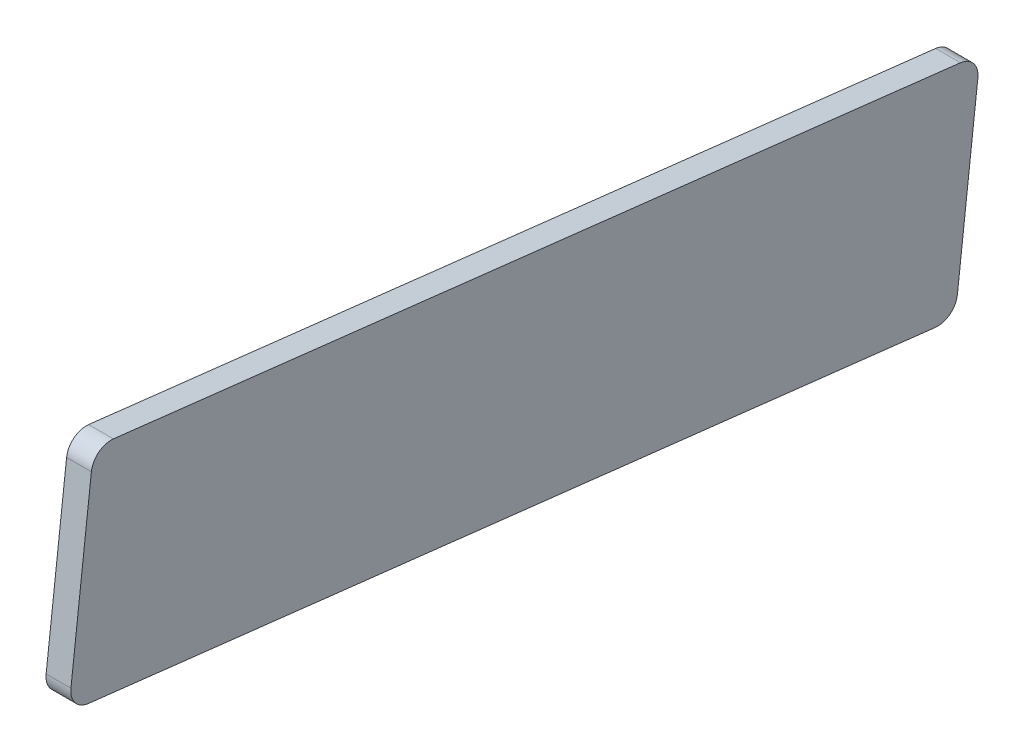
ISO-10303-21;
HEADER;
FILE_DESCRIPTION(('STEP AP214'),'2;1');
FILE_NAME('part.step','',(''),(''),'','','');
FILE_SCHEMA(('AUTOMOTIVE_DESIGN { 1 0 10303 214 1 1 1 1 }'));
ENDSEC;
DATA;
#1=APPLICATION_CONTEXT('core data for automotive mechanical design processes');
#2=APPLICATION_PROTOCOL_DEFINITION('international standard','automotive_design',2000,#1);
#3=PRODUCT_CONTEXT('',#1,'mechanical');
#4=PRODUCT('Part','Part','',(#3));
#5=PRODUCT_RELATED_PRODUCT_CATEGORY('part','',(#4));
#6=PRODUCT_DEFINITION_FORMATION('','',#4);
#7=PRODUCT_DEFINITION_CONTEXT('part definition',#1,'design');
#8=PRODUCT_DEFINITION('design','',#6,#7);
#9=PRODUCT_DEFINITION_SHAPE('','',#8);
#10=(LENGTH_UNIT() NAMED_UNIT(*) SI_UNIT(.MILLI.,.METRE.));
#11=(NAMED_UNIT(*) PLANE_ANGLE_UNIT() SI_UNIT($,.RADIAN.));
#12=(NAMED_UNIT(*) SI_UNIT($,.STERADIAN.) SOLID_ANGLE_UNIT());
#13=UNCERTAINTY_MEASURE_WITH_UNIT(LENGTH_MEASURE(1.E-05),#10,'distance_accuracy_value','');
#14=(GEOMETRIC_REPRESENTATION_CONTEXT(3) GLOBAL_UNCERTAINTY_ASSIGNED_CONTEXT((#13)) GLOBAL_UNIT_ASSIGNED_CONTEXT((#10,
#11,#12)) REPRESENTATION_CONTEXT('',''));
#15=CARTESIAN_POINT('',(0.,0.,0.));
#16=DIRECTION('',(0.,0.,1.));
#17=DIRECTION('',(1.,0.,0.));
#18=AXIS2_PLACEMENT_3D('',#15,#16,#17);
#19=CARTESIAN_POINT('',(-232.999999999979,336.189742390619,-342.664433350709));
#20=DIRECTION('',(1.,0.,0.));
#21=DIRECTION('',(0.,1.,0.));
#22=AXIS2_PLACEMENT_3D('',#19,#20,#21);
#23=CYLINDRICAL_SURFACE('',#22,2.00000000000003);
#24=CARTESIAN_POINT('',(-230.499999999979,336.189742390619,-342.664433350709));
#25=DIRECTION('',(-1.,0.,0.));
#26=DIRECTION('',(0.,-1.,0.));
#27=AXIS2_PLACEMENT_3D('',#24,#25,#26);
#28=CIRCLE('',#27,2.00000000000003);
#29=CARTESIAN_POINT('',(-230.499999999979,335.960421843306,-344.651242875193));
#30=VERTEX_POINT('',#29);
#31=CARTESIAN_POINT('',(-230.499999999979,334.202932866135,-342.435112803396));
#32=VERTEX_POINT('',#31);
#33=EDGE_CURVE('E135',#30,#32,#28,.T.);
#34=ORIENTED_EDGE('',*,*,#33,.T.);
#35=DIRECTION('',(1.,0.,0.));
#36=VECTOR('',#35,1.);
#37=CARTESIAN_POINT('',(-232.999999999979,334.202932866135,-342.435112803396));
#38=LINE('',#37,#36);
#39=CARTESIAN_POINT('',(-232.999999999979,334.202932866135,-342.435112803396));
#40=VERTEX_POINT('',#39);
#41=EDGE_CURVE('E11',#40,#32,#38,.T.);
#42=ORIENTED_EDGE('',*,*,#41,.F.);
#43=CARTESIAN_POINT('',(-232.999999999979,336.189742390619,-342.664433350709));
#44=DIRECTION('',(-1.,0.,0.));
#45=DIRECTION('',(0.,-1.,0.));
#46=AXIS2_PLACEMENT_3D('',#43,#44,#45);
#47=CIRCLE('',#46,2.00000000000003);
#48=CARTESIAN_POINT('',(-232.999999999979,335.960421843306,-344.651242875193));
#49=VERTEX_POINT('',#48);
#50=EDGE_CURVE('E149',#49,#40,#47,.T.);
#51=ORIENTED_EDGE('',*,*,#50,.F.);
#52=DIRECTION('',(1.,0.,0.));
#53=VECTOR('',#52,1.);
#54=CARTESIAN_POINT('',(-232.999999999979,335.960421843306,-344.651242875193));
#55=LINE('',#54,#53);
#56=EDGE_CURVE('E131',#49,#30,#55,.T.);
#57=ORIENTED_EDGE('',*,*,#56,.T.);
#58=EDGE_LOOP('',(#34,#42,#51,#57));
#59=FACE_BOUND('',#58,.T.);
#60=ADVANCED_FACE('F39',(#59),#23,.T.);
#61=CARTESIAN_POINT('',(-232.999999999979,334.202932866135,-342.435112803396));
#62=DIRECTION('',(0.,0.993404762241953,-0.114660273656609));
#63=DIRECTION('',(0.,0.114660273656609,0.993404762241953));
#64=AXIS2_PLACEMENT_3D('',#61,#62,#63);
#65=PLANE('',#64);
#66=DIRECTION('',(0.,0.114660273656609,0.993404762241953));
#67=VECTOR('',#66,1.);
#68=CARTESIAN_POINT('',(-230.499999999979,334.202932866135,-342.435112803396));
#69=LINE('',#68,#67);
#70=CARTESIAN_POINT('',(-230.499999999979,344.063716400603,-257.002303250588));
#71=VERTEX_POINT('',#70);
#72=EDGE_CURVE('E138',#32,#71,#69,.T.);
#73=ORIENTED_EDGE('',*,*,#72,.T.);
#74=DIRECTION('',(1.,0.,0.));
#75=VECTOR('',#74,1.);
#76=CARTESIAN_POINT('',(-232.999999999979,344.063716400603,-257.002303250588));
#77=LINE('',#76,#75);
#78=CARTESIAN_POINT('',(-232.999999999979,344.063716400603,-257.002303250588));
#79=VERTEX_POINT('',#78);
#80=EDGE_CURVE('E47',#79,#71,#77,.T.);
#81=ORIENTED_EDGE('',*,*,#80,.F.);
#82=DIRECTION('',(0.,0.114660273656609,0.993404762241953));
#83=VECTOR('',#82,1.);
#84=CARTESIAN_POINT('',(-232.999999999979,334.202932866135,-342.435112803396));
#85=LINE('',#84,#83);
#86=EDGE_CURVE('E98',#40,#79,#85,.T.);
#87=ORIENTED_EDGE('',*,*,#86,.F.);
#88=ORIENTED_EDGE('',*,*,#41,.T.);
#89=EDGE_LOOP('',(#73,#81,#87,#88));
#90=FACE_BOUND('',#89,.T.);
#91=ADVANCED_FACE('F184',(#90),#65,.F.);
#92=CARTESIAN_POINT('',(-232.999999999979,346.050525925087,-257.231623797901));
#93=DIRECTION('',(1.,0.,0.));
#94=DIRECTION('',(0.,1.,0.));
#95=AXIS2_PLACEMENT_3D('',#92,#93,#94);
#96=CYLINDRICAL_SURFACE('',#95,1.99999999999997);
#97=CARTESIAN_POINT('',(-230.499999999979,346.050525925087,-257.231623797901));
#98=DIRECTION('',(-1.,0.,0.));
#99=DIRECTION('',(0.,-1.,0.));
#100=AXIS2_PLACEMENT_3D('',#97,#98,#99);
#101=CIRCLE('',#100,1.99999999999997);
#102=CARTESIAN_POINT('',(-230.499999999979,346.2798464724,-255.244814273417));
#103=VERTEX_POINT('',#102);
#104=EDGE_CURVE('E140',#71,#103,#101,.T.);
#105=ORIENTED_EDGE('',*,*,#104,.T.);
#106=DIRECTION('',(1.,0.,0.));
#107=VECTOR('',#106,1.);
#108=CARTESIAN_POINT('',(-232.999999999979,346.2798464724,-255.244814273417));
#109=LINE('',#108,#107);
#110=CARTESIAN_POINT('',(-232.999999999979,346.2798464724,-255.244814273417));
#111=VERTEX_POINT('',#110);
#112=EDGE_CURVE('E156',#111,#103,#109,.T.);
#113=ORIENTED_EDGE('',*,*,#112,.F.);
#114=CARTESIAN_POINT('',(-232.999999999979,346.050525925087,-257.231623797901));
#115=DIRECTION('',(-1.,0.,0.));
#116=DIRECTION('',(0.,-1.,0.));
#117=AXIS2_PLACEMENT_3D('',#114,#115,#116);
#118=CIRCLE('',#117,1.99999999999997);
#119=EDGE_CURVE('E164',#79,#111,#118,.T.);
#120=ORIENTED_EDGE('',*,*,#119,.F.);
#121=ORIENTED_EDGE('',*,*,#80,.T.);
#122=EDGE_LOOP('',(#105,#113,#120,#121));
#123=FACE_BOUND('',#122,.T.);
#124=ADVANCED_FACE('F162',(#123),#96,.T.);
#125=CARTESIAN_POINT('',(-232.999999999979,346.2798464724,-255.244814273417));
#126=DIRECTION('',(0.,-0.114660273656607,-0.993404762241953));
#127=DIRECTION('',(0.,0.993404762241953,-0.114660273656607));
#128=AXIS2_PLACEMENT_3D('',#125,#126,#127);
#129=PLANE('',#128);
#130=DIRECTION('',(0.,0.993404762241953,-0.114660273656607));
#131=VECTOR('',#130,1.);
#132=CARTESIAN_POINT('',(-230.499999999979,346.2798464724,-255.244814273417));
#133=LINE('',#132,#131);
#134=CARTESIAN_POINT('',(-230.499999999979,364.161132192756,-257.308699199236));
#135=VERTEX_POINT('',#134);
#136=EDGE_CURVE('E142',#103,#135,#133,.T.);
#137=ORIENTED_EDGE('',*,*,#136,.T.);
#138=DIRECTION('',(1.,0.,0.));
#139=VECTOR('',#138,1.);
#140=CARTESIAN_POINT('',(-232.999999999979,364.161132192756,-257.308699199236));
#141=LINE('',#140,#139);
#142=CARTESIAN_POINT('',(-232.999999999979,364.161132192756,-257.308699199236));
#143=VERTEX_POINT('',#142);
#144=EDGE_CURVE('E153',#143,#135,#141,.T.);
#145=ORIENTED_EDGE('',*,*,#144,.F.);
#146=DIRECTION('',(0.,0.993404762241953,-0.114660273656607));
#147=VECTOR('',#146,1.);
#148=CARTESIAN_POINT('',(-232.999999999979,346.2798464724,-255.244814273417));
#149=LINE('',#148,#147);
#150=EDGE_CURVE('E176',#111,#143,#149,.T.);
#151=ORIENTED_EDGE('',*,*,#150,.F.);
#152=ORIENTED_EDGE('',*,*,#112,.T.);
#153=EDGE_LOOP('',(#137,#145,#151,#152));
#154=FACE_BOUND('',#153,.T.);
#155=ADVANCED_FACE('F172',(#154),#129,.F.);
#156=CARTESIAN_POINT('',(-232.999999999979,363.931811645442,-259.29550872372));
#157=DIRECTION('',(1.,0.,0.));
#158=DIRECTION('',(0.,1.,0.));
#159=AXIS2_PLACEMENT_3D('',#156,#157,#158);
#160=CYLINDRICAL_SURFACE('',#159,1.99999999999997);
#161=CARTESIAN_POINT('',(-230.499999999979,363.931811645442,-259.29550872372));
#162=DIRECTION('',(-1.,0.,0.));
#163=DIRECTION('',(0.,-1.,0.));
#164=AXIS2_PLACEMENT_3D('',#161,#162,#163);
#165=CIRCLE('',#164,1.99999999999997);
#166=CARTESIAN_POINT('',(-230.499999999979,365.918621169926,-259.524829271033));
#167=VERTEX_POINT('',#166);
#168=EDGE_CURVE('E144',#135,#167,#165,.T.);
#169=ORIENTED_EDGE('',*,*,#168,.T.);
#170=DIRECTION('',(1.,0.,0.));
#171=VECTOR('',#170,1.);
#172=CARTESIAN_POINT('',(-232.999999999979,365.918621169926,-259.524829271033));
#173=LINE('',#172,#171);
#174=CARTESIAN_POINT('',(-232.999999999979,365.918621169926,-259.524829271033));
#175=VERTEX_POINT('',#174);
#176=EDGE_CURVE('E126',#175,#167,#173,.T.);
#177=ORIENTED_EDGE('',*,*,#176,.F.);
#178=CARTESIAN_POINT('',(-232.999999999979,363.931811645442,-259.29550872372));
#179=DIRECTION('',(-1.,0.,0.));
#180=DIRECTION('',(0.,-1.,0.));
#181=AXIS2_PLACEMENT_3D('',#178,#179,#180);
#182=CIRCLE('',#181,1.99999999999997);
#183=EDGE_CURVE('E117',#143,#175,#182,.T.);
#184=ORIENTED_EDGE('',*,*,#183,.F.);
#185=ORIENTED_EDGE('',*,*,#144,.T.);
#186=EDGE_LOOP('',(#169,#177,#184,#185));
#187=FACE_BOUND('',#186,.T.);
#188=ADVANCED_FACE('F175',(#187),#160,.T.);
#189=CARTESIAN_POINT('',(-232.999999999979,365.918621169926,-259.524829271033));
#190=DIRECTION('',(0.,-0.993404762241953,0.114660273656609));
#191=DIRECTION('',(0.,-0.114660273656609,-0.993404762241953));
#192=AXIS2_PLACEMENT_3D('',#189,#190,#191);
#193=PLANE('',#192);
#194=DIRECTION('',(0.,-0.114660273656609,-0.993404762241953));
#195=VECTOR('',#194,1.);
#196=CARTESIAN_POINT('',(-230.499999999979,365.918621169926,-259.524829271033));
#197=LINE('',#196,#195);
#198=CARTESIAN_POINT('',(-230.499999999979,356.057837635458,-344.957638823841));
#199=VERTEX_POINT('',#198);
#200=EDGE_CURVE('E125',#167,#199,#197,.T.);
#201=ORIENTED_EDGE('',*,*,#200,.T.);
#202=DIRECTION('',(1.,0.,0.));
#203=VECTOR('',#202,1.);
#204=CARTESIAN_POINT('',(-232.999999999979,356.057837635458,-344.957638823841));
#205=LINE('',#204,#203);
#206=CARTESIAN_POINT('',(-232.999999999979,356.057837635458,-344.957638823841));
#207=VERTEX_POINT('',#206);
#208=EDGE_CURVE('E122',#207,#199,#205,.T.);
#209=ORIENTED_EDGE('',*,*,#208,.F.);
#210=DIRECTION('',(0.,-0.114660273656609,-0.993404762241953));
#211=VECTOR('',#210,1.);
#212=CARTESIAN_POINT('',(-232.999999999979,365.918621169926,-259.524829271033));
#213=LINE('',#212,#211);
#214=EDGE_CURVE('E111',#175,#207,#213,.T.);
#215=ORIENTED_EDGE('',*,*,#214,.F.);
#216=ORIENTED_EDGE('',*,*,#176,.T.);
#217=EDGE_LOOP('',(#201,#209,#215,#216));
#218=FACE_BOUND('',#217,.T.);
#219=ADVANCED_FACE('F123',(#218),#193,.F.);
#220=CARTESIAN_POINT('',(-232.999999999979,354.071028110974,-344.728318276528));
#221=DIRECTION('',(1.,0.,0.));
#222=DIRECTION('',(0.,1.,0.));
#223=AXIS2_PLACEMENT_3D('',#220,#221,#222);
#224=CYLINDRICAL_SURFACE('',#223,2.);
#225=CARTESIAN_POINT('',(-230.499999999979,354.071028110974,-344.728318276528));
#226=DIRECTION('',(-1.,0.,0.));
#227=DIRECTION('',(0.,-1.,0.));
#228=AXIS2_PLACEMENT_3D('',#225,#226,#227);
#229=CIRCLE('',#228,2.);
#230=CARTESIAN_POINT('',(-230.499999999979,353.841707563661,-346.715127801012));
#231=VERTEX_POINT('',#230);
#232=EDGE_CURVE('E84',#199,#231,#229,.T.);
#233=ORIENTED_EDGE('',*,*,#232,.T.);
#234=DIRECTION('',(1.,0.,0.));
#235=VECTOR('',#234,1.);
#236=CARTESIAN_POINT('',(-232.999999999979,353.841707563661,-346.715127801012));
#237=LINE('',#236,#235);
#238=CARTESIAN_POINT('',(-232.999999999979,353.841707563661,-346.715127801012));
#239=VERTEX_POINT('',#238);
#240=EDGE_CURVE('E127',#239,#231,#237,.T.);
#241=ORIENTED_EDGE('',*,*,#240,.F.);
#242=CARTESIAN_POINT('',(-232.999999999979,354.071028110974,-344.728318276528));
#243=DIRECTION('',(-1.,0.,0.));
#244=DIRECTION('',(0.,-1.,0.));
#245=AXIS2_PLACEMENT_3D('',#242,#243,#244);
#246=CIRCLE('',#245,2.);
#247=EDGE_CURVE('E115',#207,#239,#246,.T.);
#248=ORIENTED_EDGE('',*,*,#247,.F.);
#249=ORIENTED_EDGE('',*,*,#208,.T.);
#250=EDGE_LOOP('',(#233,#241,#248,#249));
#251=FACE_BOUND('',#250,.T.);
#252=ADVANCED_FACE('F129',(#251),#224,.T.);
#253=CARTESIAN_POINT('',(-232.999999999979,353.841707563661,-346.715127801012));
#254=DIRECTION('',(0.,0.114660273656604,0.993404762241954));
#255=DIRECTION('',(0.,-0.993404762241954,0.114660273656604));
#256=AXIS2_PLACEMENT_3D('',#253,#254,#255);
#257=PLANE('',#256);
#258=DIRECTION('',(0.,-0.993404762241954,0.114660273656604));
#259=VECTOR('',#258,1.);
#260=CARTESIAN_POINT('',(-230.499999999979,353.841707563661,-346.715127801012));
#261=LINE('',#260,#259);
#262=EDGE_CURVE('E90',#231,#30,#261,.T.);
#263=ORIENTED_EDGE('',*,*,#262,.T.);
#264=ORIENTED_EDGE('',*,*,#56,.F.);
#265=DIRECTION('',(0.,-0.993404762241954,0.114660273656604));
#266=VECTOR('',#265,1.);
#267=CARTESIAN_POINT('',(-232.999999999979,353.841707563661,-346.715127801012));
#268=LINE('',#267,#266);
#269=EDGE_CURVE('E55',#239,#49,#268,.T.);
#270=ORIENTED_EDGE('',*,*,#269,.F.);
#271=ORIENTED_EDGE('',*,*,#240,.T.);
#272=EDGE_LOOP('',(#263,#264,#270,#271));
#273=FACE_BOUND('',#272,.T.);
#274=ADVANCED_FACE('F200',(#273),#257,.F.);
#275=CARTESIAN_POINT('',(-232.999999999979,336.189742390619,-342.664433350709));
#276=DIRECTION('',(-1.,0.,0.));
#277=DIRECTION('',(0.,-1.,0.));
#278=AXIS2_PLACEMENT_3D('',#275,#276,#277);
#279=PLANE('',#278);
#280=ORIENTED_EDGE('',*,*,#50,.T.);
#281=ORIENTED_EDGE('',*,*,#86,.T.);
#282=ORIENTED_EDGE('',*,*,#119,.T.);
#283=ORIENTED_EDGE('',*,*,#150,.T.);
#284=ORIENTED_EDGE('',*,*,#183,.T.);
#285=ORIENTED_EDGE('',*,*,#214,.T.);
#286=ORIENTED_EDGE('',*,*,#247,.T.);
#287=ORIENTED_EDGE('',*,*,#269,.T.);
#288=EDGE_LOOP('',(#280,#281,#282,#283,#284,#285,#286,#287));
#289=FACE_BOUND('',#288,.T.);
#290=ADVANCED_FACE('F113',(#289),#279,.T.);
#291=CARTESIAN_POINT('',(-230.499999999979,336.189742390619,-342.664433350709));
#292=DIRECTION('',(-1.,0.,0.));
#293=DIRECTION('',(0.,-1.,0.));
#294=AXIS2_PLACEMENT_3D('',#291,#292,#293);
#295=PLANE('',#294);
#296=ORIENTED_EDGE('',*,*,#33,.F.);
#297=ORIENTED_EDGE('',*,*,#262,.F.);
#298=ORIENTED_EDGE('',*,*,#232,.F.);
#299=ORIENTED_EDGE('',*,*,#200,.F.);
#300=ORIENTED_EDGE('',*,*,#168,.F.);
#301=ORIENTED_EDGE('',*,*,#136,.F.);
#302=ORIENTED_EDGE('',*,*,#104,.F.);
#303=ORIENTED_EDGE('',*,*,#72,.F.);
#304=EDGE_LOOP('',(#296,#297,#298,#299,#300,#301,#302,#303));
#305=FACE_BOUND('',#304,.T.);
#306=ADVANCED_FACE('F168',(#305),#295,.F.);
#307=CLOSED_SHELL('',(#60,#91,#124,#155,#188,#219,#252,#274,#290,#306));
#308=MANIFOLD_SOLID_BREP('B2',#307);
#309=ADVANCED_BREP_SHAPE_REPRESENTATION('',(#18,#308),#14);
#310=SHAPE_DEFINITION_REPRESENTATION(#9,#309);
ENDSEC;
END-ISO-10303-21;
